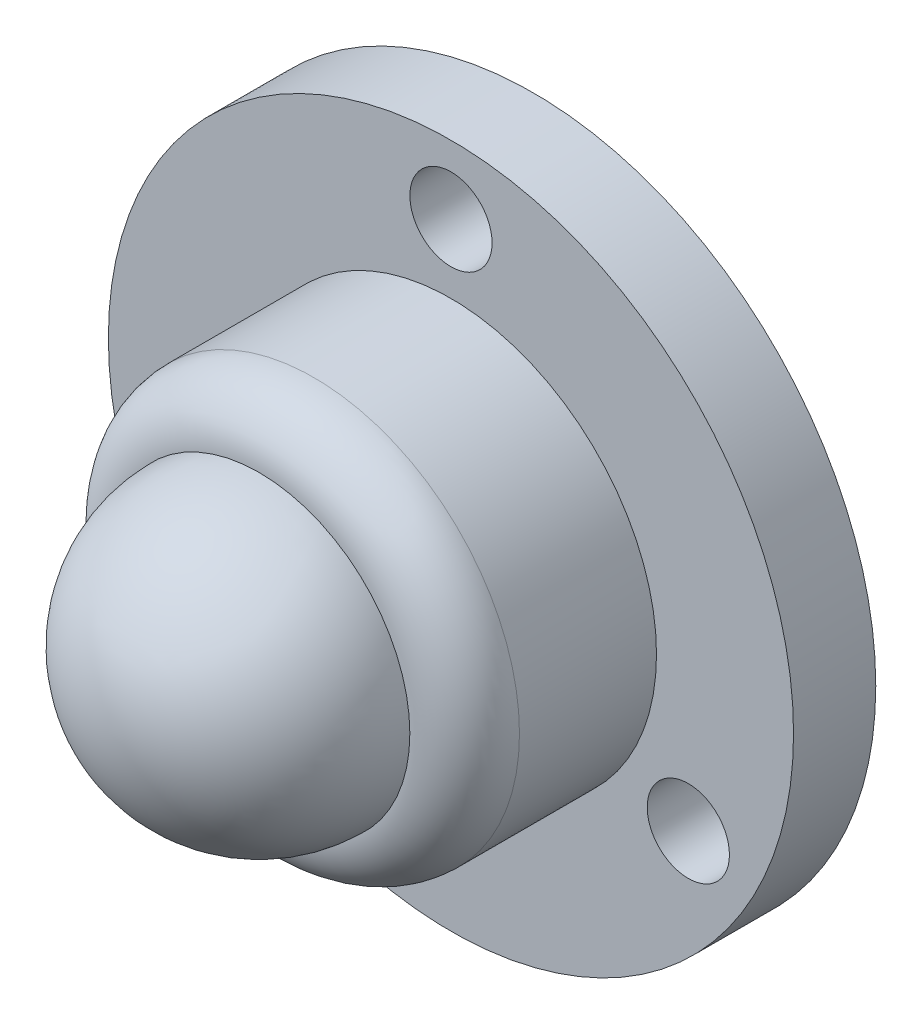
ISO-10303-21;
HEADER;
FILE_DESCRIPTION(('STEP AP214'),'2;1');
FILE_NAME('part.step','',(''),(''),'','','');
FILE_SCHEMA(('AUTOMOTIVE_DESIGN { 1 0 10303 214 1 1 1 1 }'));
ENDSEC;
DATA;
#1=APPLICATION_CONTEXT('core data for automotive mechanical design processes');
#2=APPLICATION_PROTOCOL_DEFINITION('international standard','automotive_design',2000,#1);
#3=PRODUCT_CONTEXT('',#1,'mechanical');
#4=PRODUCT('Part','Part','',(#3));
#5=PRODUCT_RELATED_PRODUCT_CATEGORY('part','',(#4));
#6=PRODUCT_DEFINITION_FORMATION('','',#4);
#7=PRODUCT_DEFINITION_CONTEXT('part definition',#1,'design');
#8=PRODUCT_DEFINITION('design','',#6,#7);
#9=PRODUCT_DEFINITION_SHAPE('','',#8);
#10=(LENGTH_UNIT() NAMED_UNIT(*) SI_UNIT(.MILLI.,.METRE.));
#11=(NAMED_UNIT(*) PLANE_ANGLE_UNIT() SI_UNIT($,.RADIAN.));
#12=(NAMED_UNIT(*) SI_UNIT($,.STERADIAN.) SOLID_ANGLE_UNIT());
#13=UNCERTAINTY_MEASURE_WITH_UNIT(LENGTH_MEASURE(1.E-05),#10,'distance_accuracy_value','');
#14=(GEOMETRIC_REPRESENTATION_CONTEXT(3) GLOBAL_UNCERTAINTY_ASSIGNED_CONTEXT((#13)) GLOBAL_UNIT_ASSIGNED_CONTEXT((#10,
#11,#12)) REPRESENTATION_CONTEXT('',''));
#15=CARTESIAN_POINT('',(0.,0.,0.));
#16=DIRECTION('',(0.,0.,1.));
#17=DIRECTION('',(1.,0.,0.));
#18=AXIS2_PLACEMENT_3D('',#15,#16,#17);
#19=CARTESIAN_POINT('',(0.,0.,0.3));
#20=DIRECTION('',(0.,0.,1.));
#21=DIRECTION('',(1.,0.,0.));
#22=AXIS2_PLACEMENT_3D('',#19,#20,#21);
#23=PLANE('',#22);
#24=CARTESIAN_POINT('',(-0.86602540378441,-0.499999999999964,0.3));
#25=DIRECTION('',(0.,0.,1.));
#26=DIRECTION('',(1.,0.,0.));
#27=AXIS2_PLACEMENT_3D('',#24,#25,#26);
#28=CIRCLE('',#27,0.150000000000005);
#29=CARTESIAN_POINT('',(-0.716025403784404,-0.499999999999964,0.3));
#30=VERTEX_POINT('',#29);
#31=EDGE_CURVE('E61',#30,#30,#28,.T.);
#32=ORIENTED_EDGE('',*,*,#31,.F.);
#33=EDGE_LOOP('',(#32));
#34=FACE_BOUND('',#33,.T.);
#35=CARTESIAN_POINT('',(0.,1.,0.3));
#36=DIRECTION('',(0.,0.,1.));
#37=DIRECTION('',(1.,0.,0.));
#38=AXIS2_PLACEMENT_3D('',#35,#36,#37);
#39=CIRCLE('',#38,0.15);
#40=CARTESIAN_POINT('',(0.15,1.,0.3));
#41=VERTEX_POINT('',#40);
#42=EDGE_CURVE('E50',#41,#41,#39,.T.);
#43=ORIENTED_EDGE('',*,*,#42,.F.);
#44=EDGE_LOOP('',(#43));
#45=FACE_BOUND('',#44,.T.);
#46=CARTESIAN_POINT('',(0.,0.,0.3));
#47=DIRECTION('',(0.,0.,1.));
#48=DIRECTION('',(1.,0.,0.));
#49=AXIS2_PLACEMENT_3D('',#46,#47,#48);
#50=CIRCLE('',#49,1.25);
#51=CARTESIAN_POINT('',(1.25,0.,0.3));
#52=VERTEX_POINT('',#51);
#53=EDGE_CURVE('E42',#52,#52,#50,.T.);
#54=ORIENTED_EDGE('',*,*,#53,.T.);
#55=EDGE_LOOP('',(#54));
#56=FACE_BOUND('',#55,.T.);
#57=CARTESIAN_POINT('',(0.866025403784422,-0.499999999999957,0.3));
#58=DIRECTION('',(0.,0.,1.));
#59=DIRECTION('',(1.,0.,0.));
#60=AXIS2_PLACEMENT_3D('',#57,#58,#59);
#61=CIRCLE('',#60,0.150000000000043);
#62=CARTESIAN_POINT('',(1.01602540378446,-0.499999999999957,0.3));
#63=VERTEX_POINT('',#62);
#64=EDGE_CURVE('E55',#63,#63,#61,.T.);
#65=ORIENTED_EDGE('',*,*,#64,.F.);
#66=EDGE_LOOP('',(#65));
#67=FACE_BOUND('',#66,.T.);
#68=CARTESIAN_POINT('',(0.,0.,0.3));
#69=DIRECTION('',(0.,0.,1.));
#70=DIRECTION('',(1.,0.,0.));
#71=AXIS2_PLACEMENT_3D('',#68,#69,#70);
#72=CIRCLE('',#71,0.75);
#73=CARTESIAN_POINT('',(0.75,0.,0.3));
#74=VERTEX_POINT('',#73);
#75=EDGE_CURVE('E67',#74,#74,#72,.T.);
#76=ORIENTED_EDGE('',*,*,#75,.F.);
#77=EDGE_LOOP('',(#76));
#78=FACE_BOUND('',#77,.T.);
#79=ADVANCED_FACE('F31',(#34,#45,#56,#67,#78),#23,.T.);
#80=CARTESIAN_POINT('',(0.,0.,0.));
#81=DIRECTION('',(0.,0.,1.));
#82=DIRECTION('',(1.,0.,0.));
#83=AXIS2_PLACEMENT_3D('',#80,#81,#82);
#84=PLANE('',#83);
#85=CARTESIAN_POINT('',(0.866025403784422,-0.499999999999957,0.));
#86=DIRECTION('',(0.,0.,1.));
#87=DIRECTION('',(1.,0.,0.));
#88=AXIS2_PLACEMENT_3D('',#85,#86,#87);
#89=CIRCLE('',#88,0.150000000000043);
#90=CARTESIAN_POINT('',(1.01602540378446,-0.499999999999957,0.));
#91=VERTEX_POINT('',#90);
#92=EDGE_CURVE('E58',#91,#91,#89,.T.);
#93=ORIENTED_EDGE('',*,*,#92,.T.);
#94=EDGE_LOOP('',(#93));
#95=FACE_BOUND('',#94,.T.);
#96=CARTESIAN_POINT('',(0.,0.,0.));
#97=DIRECTION('',(0.,0.,1.));
#98=DIRECTION('',(1.,0.,0.));
#99=AXIS2_PLACEMENT_3D('',#96,#97,#98);
#100=CIRCLE('',#99,1.25);
#101=CARTESIAN_POINT('',(1.25,0.,0.));
#102=VERTEX_POINT('',#101);
#103=EDGE_CURVE('E46',#102,#102,#100,.T.);
#104=ORIENTED_EDGE('',*,*,#103,.F.);
#105=EDGE_LOOP('',(#104));
#106=FACE_BOUND('',#105,.T.);
#107=CARTESIAN_POINT('',(0.,1.,0.));
#108=DIRECTION('',(0.,0.,1.));
#109=DIRECTION('',(1.,0.,0.));
#110=AXIS2_PLACEMENT_3D('',#107,#108,#109);
#111=CIRCLE('',#110,0.15);
#112=CARTESIAN_POINT('',(0.15,1.,0.));
#113=VERTEX_POINT('',#112);
#114=EDGE_CURVE('E52',#113,#113,#111,.T.);
#115=ORIENTED_EDGE('',*,*,#114,.T.);
#116=EDGE_LOOP('',(#115));
#117=FACE_BOUND('',#116,.T.);
#118=CARTESIAN_POINT('',(-0.86602540378441,-0.499999999999964,0.));
#119=DIRECTION('',(0.,0.,1.));
#120=DIRECTION('',(1.,0.,0.));
#121=AXIS2_PLACEMENT_3D('',#118,#119,#120);
#122=CIRCLE('',#121,0.150000000000005);
#123=CARTESIAN_POINT('',(-0.716025403784404,-0.499999999999964,0.));
#124=VERTEX_POINT('',#123);
#125=EDGE_CURVE('E64',#124,#124,#122,.T.);
#126=ORIENTED_EDGE('',*,*,#125,.T.);
#127=EDGE_LOOP('',(#126));
#128=FACE_BOUND('',#127,.T.);
#129=ADVANCED_FACE('F76',(#95,#106,#117,#128),#84,.F.);
#130=CARTESIAN_POINT('',(0.,0.,0.3));
#131=DIRECTION('',(0.,0.,-1.));
#132=DIRECTION('',(-1.,0.,0.));
#133=AXIS2_PLACEMENT_3D('',#130,#131,#132);
#134=CYLINDRICAL_SURFACE('',#133,1.25);
#135=ORIENTED_EDGE('',*,*,#53,.F.);
#136=EDGE_LOOP('',(#135));
#137=FACE_BOUND('',#136,.T.);
#138=ORIENTED_EDGE('',*,*,#103,.T.);
#139=EDGE_LOOP('',(#138));
#140=FACE_BOUND('',#139,.T.);
#141=ADVANCED_FACE('F84',(#137,#140),#134,.T.);
#142=CARTESIAN_POINT('',(0.,1.,0.3));
#143=DIRECTION('',(0.,0.,-1.));
#144=DIRECTION('',(-1.,0.,0.));
#145=AXIS2_PLACEMENT_3D('',#142,#143,#144);
#146=CYLINDRICAL_SURFACE('',#145,0.15);
#147=ORIENTED_EDGE('',*,*,#42,.T.);
#148=EDGE_LOOP('',(#147));
#149=FACE_BOUND('',#148,.T.);
#150=ORIENTED_EDGE('',*,*,#114,.F.);
#151=EDGE_LOOP('',(#150));
#152=FACE_BOUND('',#151,.T.);
#153=ADVANCED_FACE('F90',(#149,#152),#146,.F.);
#154=CARTESIAN_POINT('',(0.866025403784422,-0.499999999999957,0.3));
#155=DIRECTION('',(0.,0.,-1.));
#156=DIRECTION('',(-1.,0.,0.));
#157=AXIS2_PLACEMENT_3D('',#154,#155,#156);
#158=CYLINDRICAL_SURFACE('',#157,0.150000000000043);
#159=ORIENTED_EDGE('',*,*,#64,.T.);
#160=EDGE_LOOP('',(#159));
#161=FACE_BOUND('',#160,.T.);
#162=ORIENTED_EDGE('',*,*,#92,.F.);
#163=EDGE_LOOP('',(#162));
#164=FACE_BOUND('',#163,.T.);
#165=ADVANCED_FACE('F97',(#161,#164),#158,.F.);
#166=CARTESIAN_POINT('',(-0.86602540378441,-0.499999999999964,0.3));
#167=DIRECTION('',(0.,0.,-1.));
#168=DIRECTION('',(-1.,0.,0.));
#169=AXIS2_PLACEMENT_3D('',#166,#167,#168);
#170=CYLINDRICAL_SURFACE('',#169,0.150000000000005);
#171=ORIENTED_EDGE('',*,*,#31,.T.);
#172=EDGE_LOOP('',(#171));
#173=FACE_BOUND('',#172,.T.);
#174=ORIENTED_EDGE('',*,*,#125,.F.);
#175=EDGE_LOOP('',(#174));
#176=FACE_BOUND('',#175,.T.);
#177=ADVANCED_FACE('F108',(#173,#176),#170,.F.);
#178=CARTESIAN_POINT('',(0.,0.,1.));
#179=DIRECTION('',(0.,0.,-1.));
#180=DIRECTION('',(-1.,0.,0.));
#181=AXIS2_PLACEMENT_3D('',#178,#179,#180);
#182=CYLINDRICAL_SURFACE('',#181,0.75);
#183=CARTESIAN_POINT('',(0.,0.,0.8));
#184=DIRECTION('',(0.,0.,1.));
#185=DIRECTION('',(1.,0.,0.));
#186=AXIS2_PLACEMENT_3D('',#183,#184,#185);
#187=CIRCLE('',#186,0.75);
#188=CARTESIAN_POINT('',(0.75,0.,0.8));
#189=VERTEX_POINT('',#188);
#190=EDGE_CURVE('E10',#189,#189,#187,.F.);
#191=ORIENTED_EDGE('',*,*,#190,.T.);
#192=EDGE_LOOP('',(#191));
#193=FACE_BOUND('',#192,.T.);
#194=ORIENTED_EDGE('',*,*,#75,.T.);
#195=EDGE_LOOP('',(#194));
#196=FACE_BOUND('',#195,.T.);
#197=ADVANCED_FACE('F73',(#193,#196),#182,.T.);
#198=CARTESIAN_POINT('',(0.,0.,0.8));
#199=DIRECTION('',(0.,0.,1.));
#200=DIRECTION('',(1.,0.,0.));
#201=AXIS2_PLACEMENT_3D('',#198,#199,#200);
#202=TOROIDAL_SURFACE('',#201,0.55,0.2);
#203=ORIENTED_EDGE('',*,*,#190,.F.);
#204=EDGE_LOOP('',(#203));
#205=FACE_BOUND('',#204,.T.);
#206=CARTESIAN_POINT('',(0.,0.,1.));
#207=DIRECTION('',(0.,0.,1.));
#208=DIRECTION('',(1.,0.,0.));
#209=AXIS2_PLACEMENT_3D('',#206,#207,#208);
#210=CIRCLE('',#209,0.55);
#211=CARTESIAN_POINT('',(0.55,0.,1.));
#212=VERTEX_POINT('',#211);
#213=EDGE_CURVE('E38',#212,#212,#210,.T.);
#214=ORIENTED_EDGE('',*,*,#213,.F.);
#215=EDGE_LOOP('',(#214));
#216=FACE_BOUND('',#215,.T.);
#217=ADVANCED_FACE('F33',(#205,#216),#202,.T.);
#218=CARTESIAN_POINT('',(0.,0.,1.));
#219=DIRECTION('',(-1.,0.,0.));
#220=DIRECTION('',(0.,1.,0.));
#221=AXIS2_PLACEMENT_3D('',#218,#219,#220);
#222=SPHERICAL_SURFACE('',#221,0.55);
#223=CARTESIAN_POINT('',(0.,0.,1.));
#224=DIRECTION('',(0.,0.,1.));
#225=DIRECTION('',(1.,0.,0.));
#226=AXIS2_PLACEMENT_3D('',#223,#224,#225);
#227=SPHERICAL_SURFACE('',#226,0.55);
#228=ORIENTED_EDGE('',*,*,#213,.T.);
#229=EDGE_LOOP('',(#228));
#230=FACE_BOUND('',#229,.T.);
#231=ADVANCED_FACE('F119',(#230),#227,.T.);
#232=CLOSED_SHELL('',(#79,#129,#141,#153,#165,#177,#197,#217,#231));
#233=MANIFOLD_SOLID_BREP('B2',#232);
#234=ADVANCED_BREP_SHAPE_REPRESENTATION('',(#18,#233),#14);
#235=SHAPE_DEFINITION_REPRESENTATION(#9,#234);
ENDSEC;
END-ISO-10303-21;
